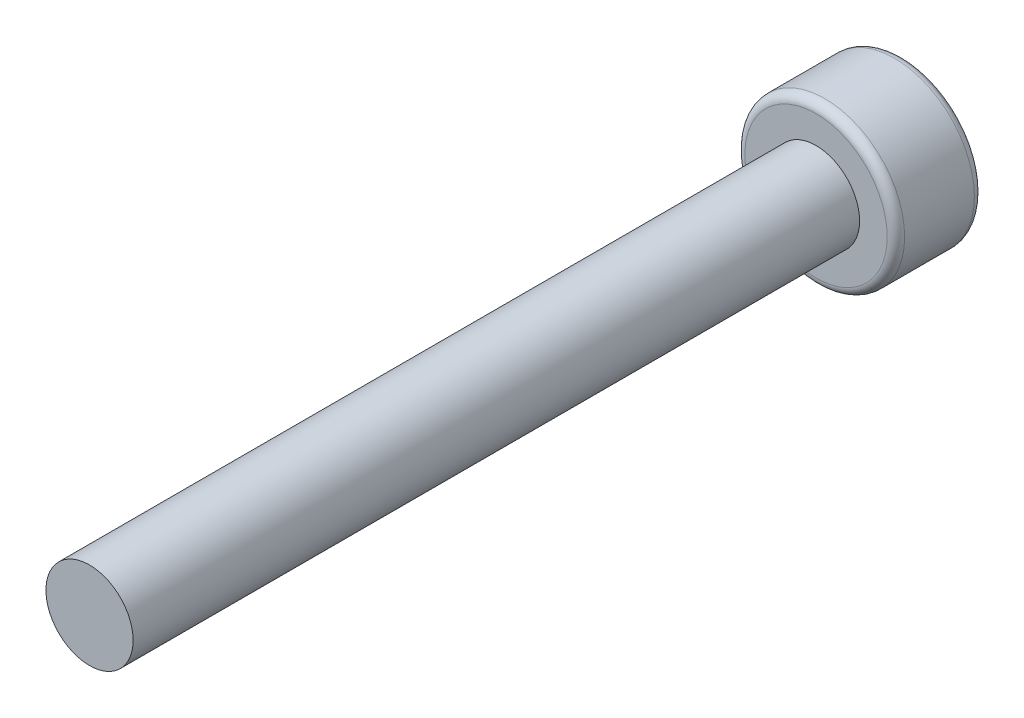
ISO-10303-21;
HEADER;
FILE_DESCRIPTION(('STEP AP214'),'2;1');
FILE_NAME('part.step','',(''),(''),'','','');
FILE_SCHEMA(('AUTOMOTIVE_DESIGN { 1 0 10303 214 1 1 1 1 }'));
ENDSEC;
DATA;
#1=APPLICATION_CONTEXT('core data for automotive mechanical design processes');
#2=APPLICATION_PROTOCOL_DEFINITION('international standard','automotive_design',2000,#1);
#3=PRODUCT_CONTEXT('',#1,'mechanical');
#4=PRODUCT('Part','Part','',(#3));
#5=PRODUCT_RELATED_PRODUCT_CATEGORY('part','',(#4));
#6=PRODUCT_DEFINITION_FORMATION('','',#4);
#7=PRODUCT_DEFINITION_CONTEXT('part definition',#1,'design');
#8=PRODUCT_DEFINITION('design','',#6,#7);
#9=PRODUCT_DEFINITION_SHAPE('','',#8);
#10=(LENGTH_UNIT() NAMED_UNIT(*) SI_UNIT(.MILLI.,.METRE.));
#11=(NAMED_UNIT(*) PLANE_ANGLE_UNIT() SI_UNIT($,.RADIAN.));
#12=(NAMED_UNIT(*) SI_UNIT($,.STERADIAN.) SOLID_ANGLE_UNIT());
#13=UNCERTAINTY_MEASURE_WITH_UNIT(LENGTH_MEASURE(1.E-05),#10,'distance_accuracy_value','');
#14=(GEOMETRIC_REPRESENTATION_CONTEXT(3) GLOBAL_UNCERTAINTY_ASSIGNED_CONTEXT((#13)) GLOBAL_UNIT_ASSIGNED_CONTEXT((#10,
#11,#12)) REPRESENTATION_CONTEXT('',''));
#15=CARTESIAN_POINT('',(0.,0.,0.));
#16=DIRECTION('',(0.,0.,1.));
#17=DIRECTION('',(1.,0.,0.));
#18=AXIS2_PLACEMENT_3D('',#15,#16,#17);
#19=CARTESIAN_POINT('',(0.,0.,3.));
#20=DIRECTION('',(0.,0.,-1.));
#21=DIRECTION('',(-1.,0.,0.));
#22=AXIS2_PLACEMENT_3D('',#19,#20,#21);
#23=CYLINDRICAL_SURFACE('',#22,2.75);
#24=CARTESIAN_POINT('',(0.,0.,0.3));
#25=DIRECTION('',(0.,0.,1.));
#26=DIRECTION('',(1.,0.,0.));
#27=AXIS2_PLACEMENT_3D('',#24,#25,#26);
#28=CIRCLE('',#27,2.75);
#29=CARTESIAN_POINT('',(2.75,0.,0.3));
#30=VERTEX_POINT('',#29);
#31=EDGE_CURVE('E152',#30,#30,#28,.T.);
#32=ORIENTED_EDGE('',*,*,#31,.T.);
#33=EDGE_LOOP('',(#32));
#34=FACE_BOUND('',#33,.T.);
#35=CARTESIAN_POINT('',(0.,0.,2.7));
#36=DIRECTION('',(0.,0.,1.));
#37=DIRECTION('',(1.,0.,0.));
#38=AXIS2_PLACEMENT_3D('',#35,#36,#37);
#39=CIRCLE('',#38,2.75);
#40=CARTESIAN_POINT('',(2.75,0.,2.7));
#41=VERTEX_POINT('',#40);
#42=EDGE_CURVE('E149',#41,#41,#39,.F.);
#43=ORIENTED_EDGE('',*,*,#42,.T.);
#44=EDGE_LOOP('',(#43));
#45=FACE_BOUND('',#44,.T.);
#46=ADVANCED_FACE('F36',(#34,#45),#23,.T.);
#47=CARTESIAN_POINT('',(0.,0.,3.));
#48=DIRECTION('',(0.,0.,1.));
#49=DIRECTION('',(1.,0.,0.));
#50=AXIS2_PLACEMENT_3D('',#47,#48,#49);
#51=PLANE('',#50);
#52=CARTESIAN_POINT('',(0.,0.,3.));
#53=DIRECTION('',(0.,0.,1.));
#54=DIRECTION('',(1.,0.,0.));
#55=AXIS2_PLACEMENT_3D('',#52,#53,#54);
#56=CIRCLE('',#55,2.45);
#57=CARTESIAN_POINT('',(2.45,0.,3.));
#58=VERTEX_POINT('',#57);
#59=EDGE_CURVE('E11',#58,#58,#56,.T.);
#60=ORIENTED_EDGE('',*,*,#59,.T.);
#61=EDGE_LOOP('',(#60));
#62=FACE_BOUND('',#61,.T.);
#63=CARTESIAN_POINT('',(0.,0.,3.));
#64=DIRECTION('',(0.,0.,1.));
#65=DIRECTION('',(1.,0.,0.));
#66=AXIS2_PLACEMENT_3D('',#63,#64,#65);
#67=CIRCLE('',#66,1.5);
#68=CARTESIAN_POINT('',(1.5,0.,3.));
#69=VERTEX_POINT('',#68);
#70=EDGE_CURVE('E146',#69,#69,#67,.T.);
#71=ORIENTED_EDGE('',*,*,#70,.F.);
#72=EDGE_LOOP('',(#71));
#73=FACE_BOUND('',#72,.T.);
#74=ADVANCED_FACE('F167',(#62,#73),#51,.T.);
#75=CARTESIAN_POINT('',(0.,0.,0.));
#76=DIRECTION('',(0.,0.,1.));
#77=DIRECTION('',(1.,0.,0.));
#78=AXIS2_PLACEMENT_3D('',#75,#76,#77);
#79=PLANE('',#78);
#80=DIRECTION('',(0.590811113127551,-0.806809908593706,0.));
#81=VECTOR('',#80,1.);
#82=CARTESIAN_POINT('',(0.820853493075304,1.8624081611757,0.));
#83=LINE('',#82,#81);
#84=CARTESIAN_POINT('',(0.820853493075304,1.8624081611757,0.));
#85=VERTEX_POINT('',#84);
#86=CARTESIAN_POINT('',(2.02331952633127,0.220324102799441,0.));
#87=VERTEX_POINT('',#86);
#88=EDGE_CURVE('E125',#85,#87,#83,.T.);
#89=ORIENTED_EDGE('',*,*,#88,.F.);
#90=DIRECTION('',(0.994123433430926,0.108252478509768,0.));
#91=VECTOR('',#90,1.);
#92=CARTESIAN_POINT('',(-1.20246603325596,1.64208405837626,0.));
#93=LINE('',#92,#91);
#94=CARTESIAN_POINT('',(-1.20246603325596,1.64208405837626,0.));
#95=VERTEX_POINT('',#94);
#96=EDGE_CURVE('E51',#95,#85,#93,.T.);
#97=ORIENTED_EDGE('',*,*,#96,.F.);
#98=DIRECTION('',(0.403312320303375,0.915062387103474,0.));
#99=VECTOR('',#98,1.);
#100=CARTESIAN_POINT('',(-2.02331952633127,-0.220324102799442,0.));
#101=LINE('',#100,#99);
#102=CARTESIAN_POINT('',(-2.02331952633127,-0.220324102799442,0.));
#103=VERTEX_POINT('',#102);
#104=EDGE_CURVE('E134',#103,#95,#101,.T.);
#105=ORIENTED_EDGE('',*,*,#104,.F.);
#106=DIRECTION('',(-0.590811113127551,0.806809908593706,0.));
#107=VECTOR('',#106,1.);
#108=CARTESIAN_POINT('',(-0.820853493075303,-1.8624081611757,0.));
#109=LINE('',#108,#107);
#110=CARTESIAN_POINT('',(-0.820853493075303,-1.8624081611757,0.));
#111=VERTEX_POINT('',#110);
#112=EDGE_CURVE('E132',#111,#103,#109,.T.);
#113=ORIENTED_EDGE('',*,*,#112,.F.);
#114=DIRECTION('',(-0.994123433430926,-0.108252478509768,0.));
#115=VECTOR('',#114,1.);
#116=CARTESIAN_POINT('',(1.20246603325596,-1.64208405837625,0.));
#117=LINE('',#116,#115);
#118=CARTESIAN_POINT('',(1.20246603325596,-1.64208405837625,0.));
#119=VERTEX_POINT('',#118);
#120=EDGE_CURVE('E99',#119,#111,#117,.T.);
#121=ORIENTED_EDGE('',*,*,#120,.F.);
#122=DIRECTION('',(-0.403312320303375,-0.915062387103474,0.));
#123=VECTOR('',#122,1.);
#124=CARTESIAN_POINT('',(2.02331952633127,0.220324102799441,0.));
#125=LINE('',#124,#123);
#126=EDGE_CURVE('E128',#87,#119,#125,.T.);
#127=ORIENTED_EDGE('',*,*,#126,.F.);
#128=EDGE_LOOP('',(#89,#97,#105,#113,#121,#127));
#129=FACE_BOUND('',#128,.T.);
#130=CARTESIAN_POINT('',(0.,0.,0.));
#131=DIRECTION('',(0.,0.,1.));
#132=DIRECTION('',(1.,0.,0.));
#133=AXIS2_PLACEMENT_3D('',#130,#131,#132);
#134=CIRCLE('',#133,2.45);
#135=CARTESIAN_POINT('',(2.45,0.,0.));
#136=VERTEX_POINT('',#135);
#137=EDGE_CURVE('E44',#136,#136,#134,.F.);
#138=ORIENTED_EDGE('',*,*,#137,.T.);
#139=EDGE_LOOP('',(#138));
#140=FACE_BOUND('',#139,.T.);
#141=ADVANCED_FACE('F157',(#129,#140),#79,.F.);
#142=CARTESIAN_POINT('',(0.,0.,28.));
#143=DIRECTION('',(0.,0.,-1.));
#144=DIRECTION('',(-1.,0.,0.));
#145=AXIS2_PLACEMENT_3D('',#142,#143,#144);
#146=CYLINDRICAL_SURFACE('',#145,1.5);
#147=CARTESIAN_POINT('',(0.,0.,28.));
#148=DIRECTION('',(0.,0.,1.));
#149=DIRECTION('',(1.,0.,0.));
#150=AXIS2_PLACEMENT_3D('',#147,#148,#149);
#151=CIRCLE('',#150,1.5);
#152=CARTESIAN_POINT('',(1.5,0.,28.));
#153=VERTEX_POINT('',#152);
#154=EDGE_CURVE('E138',#153,#153,#151,.T.);
#155=ORIENTED_EDGE('',*,*,#154,.F.);
#156=EDGE_LOOP('',(#155));
#157=FACE_BOUND('',#156,.T.);
#158=ORIENTED_EDGE('',*,*,#70,.T.);
#159=EDGE_LOOP('',(#158));
#160=FACE_BOUND('',#159,.T.);
#161=ADVANCED_FACE('F181',(#157,#160),#146,.T.);
#162=CARTESIAN_POINT('',(0.,0.,28.));
#163=DIRECTION('',(0.,0.,1.));
#164=DIRECTION('',(1.,0.,0.));
#165=AXIS2_PLACEMENT_3D('',#162,#163,#164);
#166=PLANE('',#165);
#167=ORIENTED_EDGE('',*,*,#154,.T.);
#168=EDGE_LOOP('',(#167));
#169=FACE_BOUND('',#168,.T.);
#170=ADVANCED_FACE('F162',(#169),#166,.T.);
#171=CARTESIAN_POINT('',(0.,0.,0.3));
#172=DIRECTION('',(0.,0.,1.));
#173=DIRECTION('',(1.,0.,0.));
#174=AXIS2_PLACEMENT_3D('',#171,#172,#173);
#175=TOROIDAL_SURFACE('',#174,2.45,0.3);
#176=ORIENTED_EDGE('',*,*,#137,.F.);
#177=EDGE_LOOP('',(#176));
#178=FACE_BOUND('',#177,.T.);
#179=ORIENTED_EDGE('',*,*,#31,.F.);
#180=EDGE_LOOP('',(#179));
#181=FACE_BOUND('',#180,.T.);
#182=ADVANCED_FACE('F159',(#178,#181),#175,.T.);
#183=CARTESIAN_POINT('',(0.,0.,2.7));
#184=DIRECTION('',(0.,0.,1.));
#185=DIRECTION('',(1.,0.,0.));
#186=AXIS2_PLACEMENT_3D('',#183,#184,#185);
#187=TOROIDAL_SURFACE('',#186,2.45,0.3);
#188=ORIENTED_EDGE('',*,*,#42,.F.);
#189=EDGE_LOOP('',(#188));
#190=FACE_BOUND('',#189,.T.);
#191=ORIENTED_EDGE('',*,*,#59,.F.);
#192=EDGE_LOOP('',(#191));
#193=FACE_BOUND('',#192,.T.);
#194=ADVANCED_FACE('F38',(#190,#193),#187,.T.);
#195=CARTESIAN_POINT('',(-1.20246603325596,1.64208405837626,2.));
#196=DIRECTION('',(-0.108252478509768,0.994123433430926,0.));
#197=DIRECTION('',(-0.994123433430926,-0.108252478509768,0.));
#198=AXIS2_PLACEMENT_3D('',#195,#196,#197);
#199=PLANE('',#198);
#200=ORIENTED_EDGE('',*,*,#96,.T.);
#201=DIRECTION('',(0.,0.,-1.));
#202=VECTOR('',#201,1.);
#203=CARTESIAN_POINT('',(0.820853493075304,1.8624081611757,2.));
#204=LINE('',#203,#202);
#205=CARTESIAN_POINT('',(0.820853493075304,1.8624081611757,2.));
#206=VERTEX_POINT('',#205);
#207=EDGE_CURVE('E81',#206,#85,#204,.T.);
#208=ORIENTED_EDGE('',*,*,#207,.F.);
#209=DIRECTION('',(0.994123433430926,0.108252478509768,0.));
#210=VECTOR('',#209,1.);
#211=CARTESIAN_POINT('',(-1.20246603325596,1.64208405837626,2.));
#212=LINE('',#211,#210);
#213=CARTESIAN_POINT('',(-1.20246603325596,1.64208405837626,2.));
#214=VERTEX_POINT('',#213);
#215=EDGE_CURVE('E136',#214,#206,#212,.T.);
#216=ORIENTED_EDGE('',*,*,#215,.F.);
#217=DIRECTION('',(0.,0.,-1.));
#218=VECTOR('',#217,1.);
#219=CARTESIAN_POINT('',(-1.20246603325596,1.64208405837626,2.));
#220=LINE('',#219,#218);
#221=EDGE_CURVE('E59',#214,#95,#220,.T.);
#222=ORIENTED_EDGE('',*,*,#221,.T.);
#223=EDGE_LOOP('',(#200,#208,#216,#222));
#224=FACE_BOUND('',#223,.T.);
#225=ADVANCED_FACE('F173',(#224),#199,.F.);
#226=CARTESIAN_POINT('',(-2.02331952633127,-0.220324102799442,2.));
#227=DIRECTION('',(-0.915062387103474,0.403312320303375,0.));
#228=DIRECTION('',(-0.403312320303375,-0.915062387103474,0.));
#229=AXIS2_PLACEMENT_3D('',#226,#227,#228);
#230=PLANE('',#229);
#231=ORIENTED_EDGE('',*,*,#104,.T.);
#232=ORIENTED_EDGE('',*,*,#221,.F.);
#233=DIRECTION('',(0.403312320303375,0.915062387103474,0.));
#234=VECTOR('',#233,1.);
#235=CARTESIAN_POINT('',(-2.02331952633127,-0.220324102799442,2.));
#236=LINE('',#235,#234);
#237=CARTESIAN_POINT('',(-2.02331952633127,-0.220324102799442,2.));
#238=VERTEX_POINT('',#237);
#239=EDGE_CURVE('E111',#238,#214,#236,.T.);
#240=ORIENTED_EDGE('',*,*,#239,.F.);
#241=DIRECTION('',(0.,0.,-1.));
#242=VECTOR('',#241,1.);
#243=CARTESIAN_POINT('',(-2.02331952633127,-0.220324102799442,2.));
#244=LINE('',#243,#242);
#245=EDGE_CURVE('E103',#238,#103,#244,.T.);
#246=ORIENTED_EDGE('',*,*,#245,.T.);
#247=EDGE_LOOP('',(#231,#232,#240,#246));
#248=FACE_BOUND('',#247,.T.);
#249=ADVANCED_FACE('F197',(#248),#230,.F.);
#250=CARTESIAN_POINT('',(-0.820853493075303,-1.8624081611757,2.));
#251=DIRECTION('',(-0.806809908593706,-0.590811113127551,0.));
#252=DIRECTION('',(0.590811113127551,-0.806809908593706,0.));
#253=AXIS2_PLACEMENT_3D('',#250,#251,#252);
#254=PLANE('',#253);
#255=ORIENTED_EDGE('',*,*,#112,.T.);
#256=ORIENTED_EDGE('',*,*,#245,.F.);
#257=DIRECTION('',(-0.590811113127551,0.806809908593706,0.));
#258=VECTOR('',#257,1.);
#259=CARTESIAN_POINT('',(-0.820853493075303,-1.8624081611757,2.));
#260=LINE('',#259,#258);
#261=CARTESIAN_POINT('',(-0.820853493075303,-1.8624081611757,2.));
#262=VERTEX_POINT('',#261);
#263=EDGE_CURVE('E107',#262,#238,#260,.T.);
#264=ORIENTED_EDGE('',*,*,#263,.F.);
#265=DIRECTION('',(0.,0.,-1.));
#266=VECTOR('',#265,1.);
#267=CARTESIAN_POINT('',(-0.820853493075303,-1.8624081611757,2.));
#268=LINE('',#267,#266);
#269=EDGE_CURVE('E92',#262,#111,#268,.T.);
#270=ORIENTED_EDGE('',*,*,#269,.T.);
#271=EDGE_LOOP('',(#255,#256,#264,#270));
#272=FACE_BOUND('',#271,.T.);
#273=ADVANCED_FACE('F108',(#272),#254,.F.);
#274=CARTESIAN_POINT('',(1.20246603325596,-1.64208405837625,2.));
#275=DIRECTION('',(0.108252478509768,-0.994123433430926,0.));
#276=DIRECTION('',(0.994123433430926,0.108252478509768,0.));
#277=AXIS2_PLACEMENT_3D('',#274,#275,#276);
#278=PLANE('',#277);
#279=ORIENTED_EDGE('',*,*,#120,.T.);
#280=ORIENTED_EDGE('',*,*,#269,.F.);
#281=DIRECTION('',(-0.994123433430926,-0.108252478509768,0.));
#282=VECTOR('',#281,1.);
#283=CARTESIAN_POINT('',(1.20246603325596,-1.64208405837625,2.));
#284=LINE('',#283,#282);
#285=CARTESIAN_POINT('',(1.20246603325596,-1.64208405837625,2.));
#286=VERTEX_POINT('',#285);
#287=EDGE_CURVE('E96',#286,#262,#284,.T.);
#288=ORIENTED_EDGE('',*,*,#287,.F.);
#289=DIRECTION('',(0.,0.,-1.));
#290=VECTOR('',#289,1.);
#291=CARTESIAN_POINT('',(1.20246603325596,-1.64208405837625,2.));
#292=LINE('',#291,#290);
#293=EDGE_CURVE('E104',#286,#119,#292,.T.);
#294=ORIENTED_EDGE('',*,*,#293,.T.);
#295=EDGE_LOOP('',(#279,#280,#288,#294));
#296=FACE_BOUND('',#295,.T.);
#297=ADVANCED_FACE('F94',(#296),#278,.F.);
#298=CARTESIAN_POINT('',(2.02331952633127,0.220324102799441,2.));
#299=DIRECTION('',(0.915062387103474,-0.403312320303375,0.));
#300=DIRECTION('',(0.403312320303375,0.915062387103474,0.));
#301=AXIS2_PLACEMENT_3D('',#298,#299,#300);
#302=PLANE('',#301);
#303=ORIENTED_EDGE('',*,*,#126,.T.);
#304=ORIENTED_EDGE('',*,*,#293,.F.);
#305=DIRECTION('',(-0.403312320303375,-0.915062387103474,0.));
#306=VECTOR('',#305,1.);
#307=CARTESIAN_POINT('',(2.02331952633127,0.220324102799441,2.));
#308=LINE('',#307,#306);
#309=CARTESIAN_POINT('',(2.02331952633127,0.220324102799441,2.));
#310=VERTEX_POINT('',#309);
#311=EDGE_CURVE('E117',#310,#286,#308,.T.);
#312=ORIENTED_EDGE('',*,*,#311,.F.);
#313=DIRECTION('',(0.,0.,-1.));
#314=VECTOR('',#313,1.);
#315=CARTESIAN_POINT('',(2.02331952633127,0.220324102799441,2.));
#316=LINE('',#315,#314);
#317=EDGE_CURVE('E141',#310,#87,#316,.T.);
#318=ORIENTED_EDGE('',*,*,#317,.T.);
#319=EDGE_LOOP('',(#303,#304,#312,#318));
#320=FACE_BOUND('',#319,.T.);
#321=ADVANCED_FACE('F201',(#320),#302,.F.);
#322=CARTESIAN_POINT('',(0.820853493075304,1.8624081611757,2.));
#323=DIRECTION('',(0.806809908593706,0.590811113127551,0.));
#324=DIRECTION('',(-0.590811113127551,0.806809908593706,0.));
#325=AXIS2_PLACEMENT_3D('',#322,#323,#324);
#326=PLANE('',#325);
#327=ORIENTED_EDGE('',*,*,#88,.T.);
#328=ORIENTED_EDGE('',*,*,#317,.F.);
#329=DIRECTION('',(0.590811113127551,-0.806809908593706,0.));
#330=VECTOR('',#329,1.);
#331=CARTESIAN_POINT('',(0.820853493075304,1.8624081611757,2.));
#332=LINE('',#331,#330);
#333=EDGE_CURVE('E119',#206,#310,#332,.T.);
#334=ORIENTED_EDGE('',*,*,#333,.F.);
#335=ORIENTED_EDGE('',*,*,#207,.T.);
#336=EDGE_LOOP('',(#327,#328,#334,#335));
#337=FACE_BOUND('',#336,.T.);
#338=ADVANCED_FACE('F198',(#337),#326,.F.);
#339=CARTESIAN_POINT('',(0.,0.,2.));
#340=DIRECTION('',(0.,0.,-1.));
#341=DIRECTION('',(-1.,0.,0.));
#342=AXIS2_PLACEMENT_3D('',#339,#340,#341);
#343=PLANE('',#342);
#344=ORIENTED_EDGE('',*,*,#215,.T.);
#345=ORIENTED_EDGE('',*,*,#333,.T.);
#346=ORIENTED_EDGE('',*,*,#311,.T.);
#347=ORIENTED_EDGE('',*,*,#287,.T.);
#348=ORIENTED_EDGE('',*,*,#263,.T.);
#349=ORIENTED_EDGE('',*,*,#239,.T.);
#350=EDGE_LOOP('',(#344,#345,#346,#347,#348,#349));
#351=FACE_BOUND('',#350,.T.);
#352=ADVANCED_FACE('F114',(#351),#343,.T.);
#353=CLOSED_SHELL('',(#46,#74,#141,#161,#170,#182,#194,#225,#249,#273,#297,#321,#338,#352));
#354=MANIFOLD_SOLID_BREP('B2',#353);
#355=ADVANCED_BREP_SHAPE_REPRESENTATION('',(#18,#354),#14);
#356=SHAPE_DEFINITION_REPRESENTATION(#9,#355);
ENDSEC;
END-ISO-10303-21;
